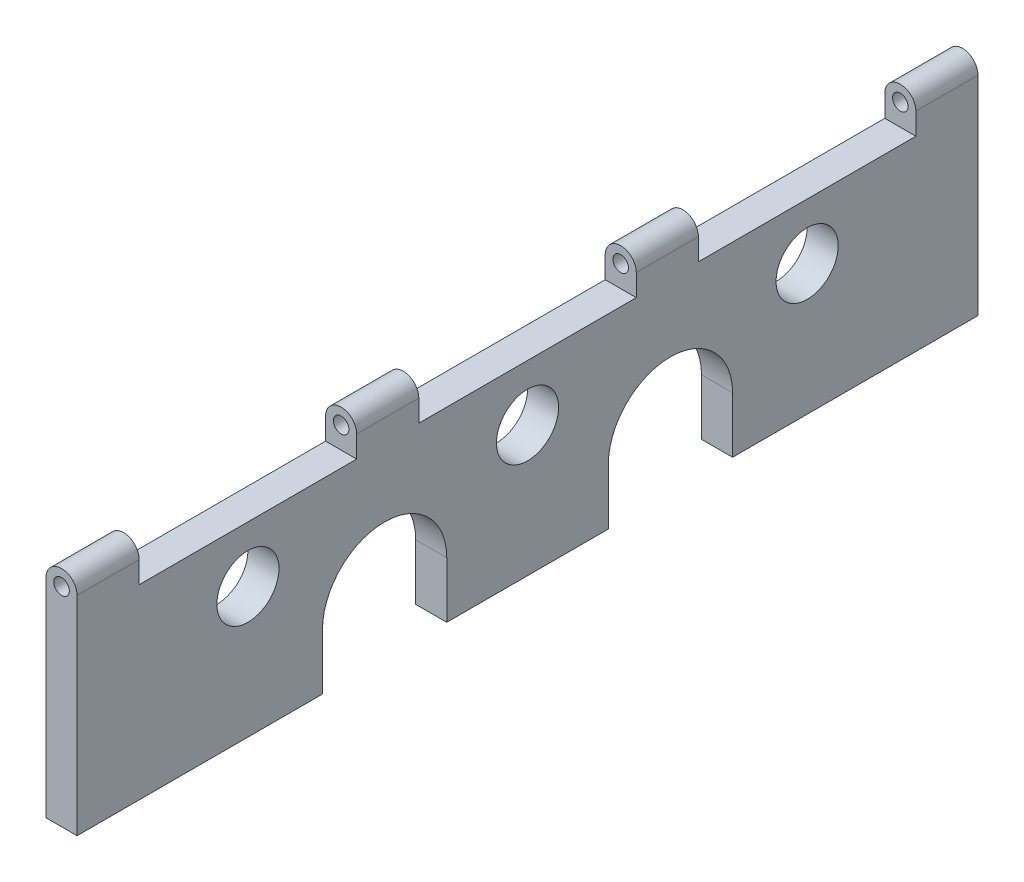
ISO-10303-21;
HEADER;
FILE_DESCRIPTION(('STEP AP214'),'2;1');
FILE_NAME('part.step','',(''),(''),'','','');
FILE_SCHEMA(('AUTOMOTIVE_DESIGN { 1 0 10303 214 1 1 1 1 }'));
ENDSEC;
DATA;
#1=APPLICATION_CONTEXT('core data for automotive mechanical design processes');
#2=APPLICATION_PROTOCOL_DEFINITION('international standard','automotive_design',2000,#1);
#3=PRODUCT_CONTEXT('',#1,'mechanical');
#4=PRODUCT('Part','Part','',(#3));
#5=PRODUCT_RELATED_PRODUCT_CATEGORY('part','',(#4));
#6=PRODUCT_DEFINITION_FORMATION('','',#4);
#7=PRODUCT_DEFINITION_CONTEXT('part definition',#1,'design');
#8=PRODUCT_DEFINITION('design','',#6,#7);
#9=PRODUCT_DEFINITION_SHAPE('','',#8);
#10=(LENGTH_UNIT() NAMED_UNIT(*) SI_UNIT(.MILLI.,.METRE.));
#11=(NAMED_UNIT(*) PLANE_ANGLE_UNIT() SI_UNIT($,.RADIAN.));
#12=(NAMED_UNIT(*) SI_UNIT($,.STERADIAN.) SOLID_ANGLE_UNIT());
#13=UNCERTAINTY_MEASURE_WITH_UNIT(LENGTH_MEASURE(1.E-05),#10,'distance_accuracy_value','');
#14=(GEOMETRIC_REPRESENTATION_CONTEXT(3) GLOBAL_UNCERTAINTY_ASSIGNED_CONTEXT((#13)) GLOBAL_UNIT_ASSIGNED_CONTEXT((#10,
#11,#12)) REPRESENTATION_CONTEXT('',''));
#15=CARTESIAN_POINT('',(0.,0.,0.));
#16=DIRECTION('',(0.,0.,1.));
#17=DIRECTION('',(1.,0.,0.));
#18=AXIS2_PLACEMENT_3D('',#15,#16,#17);
#19=CARTESIAN_POINT('',(5.,0.,0.));
#20=DIRECTION('',(0.,0.,-1.));
#21=DIRECTION('',(-1.,0.,0.));
#22=AXIS2_PLACEMENT_3D('',#19,#20,#21);
#23=PLANE('',#22);
#24=CARTESIAN_POINT('',(2.5,33.5,0.));
#25=DIRECTION('',(0.,0.,1.));
#26=DIRECTION('',(1.,0.,0.));
#27=AXIS2_PLACEMENT_3D('',#24,#25,#26);
#28=CIRCLE('',#27,1.25);
#29=CARTESIAN_POINT('',(3.75,33.5,0.));
#30=VERTEX_POINT('',#29);
#31=EDGE_CURVE('E504',#30,#30,#28,.T.);
#32=ORIENTED_EDGE('',*,*,#31,.F.);
#33=EDGE_LOOP('',(#32));
#34=FACE_BOUND('',#33,.T.);
#35=DIRECTION('',(0.,-1.,0.));
#36=VECTOR('',#35,1.);
#37=CARTESIAN_POINT('',(5.,0.,0.));
#38=LINE('',#37,#36);
#39=CARTESIAN_POINT('',(5.,33.5,0.));
#40=VERTEX_POINT('',#39);
#41=CARTESIAN_POINT('',(5.,0.,0.));
#42=VERTEX_POINT('',#41);
#43=EDGE_CURVE('E258',#40,#42,#38,.T.);
#44=ORIENTED_EDGE('',*,*,#43,.F.);
#45=CARTESIAN_POINT('',(2.5,33.5,0.));
#46=DIRECTION('',(0.,0.,1.));
#47=DIRECTION('',(1.,0.,0.));
#48=AXIS2_PLACEMENT_3D('',#45,#46,#47);
#49=CIRCLE('',#48,2.5);
#50=CARTESIAN_POINT('',(0.,33.5,0.));
#51=VERTEX_POINT('',#50);
#52=EDGE_CURVE('E242',#40,#51,#49,.T.);
#53=ORIENTED_EDGE('',*,*,#52,.T.);
#54=DIRECTION('',(0.,-1.,0.));
#55=VECTOR('',#54,1.);
#56=CARTESIAN_POINT('',(0.,0.,0.));
#57=LINE('',#56,#55);
#58=CARTESIAN_POINT('',(0.,0.,0.));
#59=VERTEX_POINT('',#58);
#60=EDGE_CURVE('E303',#51,#59,#57,.T.);
#61=ORIENTED_EDGE('',*,*,#60,.T.);
#62=DIRECTION('',(-1.,0.,0.));
#63=VECTOR('',#62,1.);
#64=CARTESIAN_POINT('',(5.,0.,0.));
#65=LINE('',#64,#63);
#66=EDGE_CURVE('E89',#42,#59,#65,.T.);
#67=ORIENTED_EDGE('',*,*,#66,.F.);
#68=EDGE_LOOP('',(#44,#53,#61,#67));
#69=FACE_BOUND('',#68,.T.);
#70=ADVANCED_FACE('F81',(#34,#69),#23,.F.);
#71=CARTESIAN_POINT('',(5.,0.,-145.));
#72=DIRECTION('',(0.,0.,1.));
#73=DIRECTION('',(1.,0.,0.));
#74=AXIS2_PLACEMENT_3D('',#71,#72,#73);
#75=PLANE('',#74);
#76=CARTESIAN_POINT('',(2.5,33.5,-145.));
#77=DIRECTION('',(0.,0.,1.));
#78=DIRECTION('',(1.,0.,0.));
#79=AXIS2_PLACEMENT_3D('',#76,#77,#78);
#80=CIRCLE('',#79,1.25);
#81=CARTESIAN_POINT('',(3.75,33.5,-145.));
#82=VERTEX_POINT('',#81);
#83=EDGE_CURVE('E407',#82,#82,#80,.T.);
#84=ORIENTED_EDGE('',*,*,#83,.T.);
#85=EDGE_LOOP('',(#84));
#86=FACE_BOUND('',#85,.T.);
#87=CARTESIAN_POINT('',(2.5,33.5,-145.));
#88=DIRECTION('',(0.,0.,1.));
#89=DIRECTION('',(1.,0.,0.));
#90=AXIS2_PLACEMENT_3D('',#87,#88,#89);
#91=CIRCLE('',#90,2.5);
#92=CARTESIAN_POINT('',(5.,33.5,-145.));
#93=VERTEX_POINT('',#92);
#94=CARTESIAN_POINT('',(0.,33.5,-145.));
#95=VERTEX_POINT('',#94);
#96=EDGE_CURVE('E252',#93,#95,#91,.T.);
#97=ORIENTED_EDGE('',*,*,#96,.F.);
#98=DIRECTION('',(0.,1.,0.));
#99=VECTOR('',#98,1.);
#100=CARTESIAN_POINT('',(5.,0.,-145.));
#101=LINE('',#100,#99);
#102=CARTESIAN_POINT('',(5.,0.,-145.));
#103=VERTEX_POINT('',#102);
#104=EDGE_CURVE('E295',#103,#93,#101,.T.);
#105=ORIENTED_EDGE('',*,*,#104,.F.);
#106=DIRECTION('',(-1.,0.,0.));
#107=VECTOR('',#106,1.);
#108=CARTESIAN_POINT('',(5.,0.,-145.));
#109=LINE('',#108,#107);
#110=CARTESIAN_POINT('',(0.,0.,-145.));
#111=VERTEX_POINT('',#110);
#112=EDGE_CURVE('E301',#103,#111,#109,.T.);
#113=ORIENTED_EDGE('',*,*,#112,.T.);
#114=DIRECTION('',(0.,1.,0.));
#115=VECTOR('',#114,1.);
#116=CARTESIAN_POINT('',(0.,0.,-145.));
#117=LINE('',#116,#115);
#118=EDGE_CURVE('E324',#111,#95,#117,.T.);
#119=ORIENTED_EDGE('',*,*,#118,.T.);
#120=EDGE_LOOP('',(#97,#105,#113,#119));
#121=FACE_BOUND('',#120,.T.);
#122=ADVANCED_FACE('F400',(#86,#121),#75,.F.);
#123=CARTESIAN_POINT('',(0.,0.,-9.99999999999998));
#124=DIRECTION('',(0.,0.,1.));
#125=DIRECTION('',(0.,-1.,0.));
#126=AXIS2_PLACEMENT_3D('',#123,#124,#125);
#127=PLANE('',#126);
#128=CARTESIAN_POINT('',(2.5,33.5,-9.99999999999998));
#129=DIRECTION('',(0.,0.,1.));
#130=DIRECTION('',(0.,-1.,0.));
#131=AXIS2_PLACEMENT_3D('',#128,#129,#130);
#132=CIRCLE('',#131,1.25);
#133=CARTESIAN_POINT('',(2.5,32.25,-9.99999999999998));
#134=VERTEX_POINT('',#133);
#135=EDGE_CURVE('E253',#134,#134,#132,.T.);
#136=ORIENTED_EDGE('',*,*,#135,.T.);
#137=EDGE_LOOP('',(#136));
#138=FACE_BOUND('',#137,.T.);
#139=CARTESIAN_POINT('',(2.5,33.5,-9.99999999999998));
#140=DIRECTION('',(0.,0.,1.));
#141=DIRECTION('',(0.,-1.,0.));
#142=AXIS2_PLACEMENT_3D('',#139,#140,#141);
#143=CIRCLE('',#142,2.5);
#144=CARTESIAN_POINT('',(5.,33.5,-9.99999999999998));
#145=VERTEX_POINT('',#144);
#146=CARTESIAN_POINT('',(0.,33.5,-9.99999999999998));
#147=VERTEX_POINT('',#146);
#148=EDGE_CURVE('E416',#145,#147,#143,.T.);
#149=ORIENTED_EDGE('',*,*,#148,.F.);
#150=DIRECTION('',(0.,-1.,0.));
#151=VECTOR('',#150,1.);
#152=CARTESIAN_POINT('',(5.,0.,-9.99999999999998));
#153=LINE('',#152,#151);
#154=CARTESIAN_POINT('',(5.,30.,-9.99999999999999));
#155=VERTEX_POINT('',#154);
#156=EDGE_CURVE('E261',#145,#155,#153,.T.);
#157=ORIENTED_EDGE('',*,*,#156,.T.);
#158=DIRECTION('',(1.,0.,0.));
#159=VECTOR('',#158,1.);
#160=CARTESIAN_POINT('',(0.,30.,-9.99999999999999));
#161=LINE('',#160,#159);
#162=CARTESIAN_POINT('',(0.,30.,-9.99999999999999));
#163=VERTEX_POINT('',#162);
#164=EDGE_CURVE('E453',#163,#155,#161,.T.);
#165=ORIENTED_EDGE('',*,*,#164,.F.);
#166=DIRECTION('',(0.,-1.,0.));
#167=VECTOR('',#166,1.);
#168=CARTESIAN_POINT('',(0.,0.,-9.99999999999998));
#169=LINE('',#168,#167);
#170=EDGE_CURVE('E451',#147,#163,#169,.T.);
#171=ORIENTED_EDGE('',*,*,#170,.F.);
#172=EDGE_LOOP('',(#149,#157,#165,#171));
#173=FACE_BOUND('',#172,.T.);
#174=ADVANCED_FACE('F499',(#138,#173),#127,.F.);
#175=CARTESIAN_POINT('',(0.,0.,-55.));
#176=DIRECTION('',(0.,0.,1.));
#177=DIRECTION('',(0.,-1.,0.));
#178=AXIS2_PLACEMENT_3D('',#175,#176,#177);
#179=PLANE('',#178);
#180=CARTESIAN_POINT('',(2.5,33.5,-55.));
#181=DIRECTION('',(0.,0.,1.));
#182=DIRECTION('',(0.,-1.,0.));
#183=AXIS2_PLACEMENT_3D('',#180,#181,#182);
#184=CIRCLE('',#183,1.25);
#185=CARTESIAN_POINT('',(2.5,32.25,-55.));
#186=VERTEX_POINT('',#185);
#187=EDGE_CURVE('E520',#186,#186,#184,.T.);
#188=ORIENTED_EDGE('',*,*,#187,.T.);
#189=EDGE_LOOP('',(#188));
#190=FACE_BOUND('',#189,.T.);
#191=CARTESIAN_POINT('',(2.5,33.5,-55.));
#192=DIRECTION('',(0.,0.,1.));
#193=DIRECTION('',(0.,-1.,0.));
#194=AXIS2_PLACEMENT_3D('',#191,#192,#193);
#195=CIRCLE('',#194,2.5);
#196=CARTESIAN_POINT('',(5.,33.5,-55.));
#197=VERTEX_POINT('',#196);
#198=CARTESIAN_POINT('',(0.,33.5,-55.));
#199=VERTEX_POINT('',#198);
#200=EDGE_CURVE('E419',#197,#199,#195,.T.);
#201=ORIENTED_EDGE('',*,*,#200,.F.);
#202=DIRECTION('',(0.,-1.,0.));
#203=VECTOR('',#202,1.);
#204=CARTESIAN_POINT('',(5.,0.,-55.));
#205=LINE('',#204,#203);
#206=CARTESIAN_POINT('',(5.,30.,-55.));
#207=VERTEX_POINT('',#206);
#208=EDGE_CURVE('E441',#197,#207,#205,.T.);
#209=ORIENTED_EDGE('',*,*,#208,.T.);
#210=DIRECTION('',(1.,0.,0.));
#211=VECTOR('',#210,1.);
#212=CARTESIAN_POINT('',(0.,30.,-55.));
#213=LINE('',#212,#211);
#214=CARTESIAN_POINT('',(0.,30.,-55.));
#215=VERTEX_POINT('',#214);
#216=EDGE_CURVE('E446',#215,#207,#213,.T.);
#217=ORIENTED_EDGE('',*,*,#216,.F.);
#218=DIRECTION('',(0.,-1.,0.));
#219=VECTOR('',#218,1.);
#220=CARTESIAN_POINT('',(0.,0.,-55.));
#221=LINE('',#220,#219);
#222=EDGE_CURVE('E440',#199,#215,#221,.T.);
#223=ORIENTED_EDGE('',*,*,#222,.F.);
#224=EDGE_LOOP('',(#201,#209,#217,#223));
#225=FACE_BOUND('',#224,.T.);
#226=ADVANCED_FACE('F547',(#190,#225),#179,.F.);
#227=CARTESIAN_POINT('',(0.,0.,-45.));
#228=DIRECTION('',(0.,0.,1.));
#229=DIRECTION('',(0.,-1.,0.));
#230=AXIS2_PLACEMENT_3D('',#227,#228,#229);
#231=PLANE('',#230);
#232=CARTESIAN_POINT('',(2.5,33.5,-45.));
#233=DIRECTION('',(0.,0.,1.));
#234=DIRECTION('',(0.,-1.,0.));
#235=AXIS2_PLACEMENT_3D('',#232,#233,#234);
#236=CIRCLE('',#235,1.25);
#237=CARTESIAN_POINT('',(2.5,32.25,-45.));
#238=VERTEX_POINT('',#237);
#239=EDGE_CURVE('E517',#238,#238,#236,.T.);
#240=ORIENTED_EDGE('',*,*,#239,.F.);
#241=EDGE_LOOP('',(#240));
#242=FACE_BOUND('',#241,.T.);
#243=DIRECTION('',(0.,-1.,0.));
#244=VECTOR('',#243,1.);
#245=CARTESIAN_POINT('',(5.,0.,-45.));
#246=LINE('',#245,#244);
#247=CARTESIAN_POINT('',(5.,33.5,-45.));
#248=VERTEX_POINT('',#247);
#249=CARTESIAN_POINT('',(5.,30.,-45.));
#250=VERTEX_POINT('',#249);
#251=EDGE_CURVE('E435',#248,#250,#246,.T.);
#252=ORIENTED_EDGE('',*,*,#251,.F.);
#253=CARTESIAN_POINT('',(2.5,33.5,-45.));
#254=DIRECTION('',(0.,0.,1.));
#255=DIRECTION('',(0.,-1.,0.));
#256=AXIS2_PLACEMENT_3D('',#253,#254,#255);
#257=CIRCLE('',#256,2.5);
#258=CARTESIAN_POINT('',(0.,33.5,-45.));
#259=VERTEX_POINT('',#258);
#260=EDGE_CURVE('E532',#248,#259,#257,.T.);
#261=ORIENTED_EDGE('',*,*,#260,.T.);
#262=DIRECTION('',(0.,-1.,0.));
#263=VECTOR('',#262,1.);
#264=CARTESIAN_POINT('',(0.,0.,-45.));
#265=LINE('',#264,#263);
#266=CARTESIAN_POINT('',(0.,30.,-45.));
#267=VERTEX_POINT('',#266);
#268=EDGE_CURVE('E438',#259,#267,#265,.T.);
#269=ORIENTED_EDGE('',*,*,#268,.T.);
#270=DIRECTION('',(1.,0.,0.));
#271=VECTOR('',#270,1.);
#272=CARTESIAN_POINT('',(0.,30.,-45.));
#273=LINE('',#272,#271);
#274=EDGE_CURVE('E443',#267,#250,#273,.T.);
#275=ORIENTED_EDGE('',*,*,#274,.T.);
#276=EDGE_LOOP('',(#252,#261,#269,#275));
#277=FACE_BOUND('',#276,.T.);
#278=ADVANCED_FACE('F652',(#242,#277),#231,.T.);
#279=CARTESIAN_POINT('',(0.,0.,-100.));
#280=DIRECTION('',(0.,0.,1.));
#281=DIRECTION('',(1.,0.,0.));
#282=AXIS2_PLACEMENT_3D('',#279,#280,#281);
#283=PLANE('',#282);
#284=CARTESIAN_POINT('',(2.5,33.5,-100.));
#285=DIRECTION('',(0.,0.,1.));
#286=DIRECTION('',(1.,0.,0.));
#287=AXIS2_PLACEMENT_3D('',#284,#285,#286);
#288=CIRCLE('',#287,1.25);
#289=CARTESIAN_POINT('',(3.75,33.5,-100.));
#290=VERTEX_POINT('',#289);
#291=EDGE_CURVE('E514',#290,#290,#288,.T.);
#292=ORIENTED_EDGE('',*,*,#291,.T.);
#293=EDGE_LOOP('',(#292));
#294=FACE_BOUND('',#293,.T.);
#295=CARTESIAN_POINT('',(2.5,33.5,-100.));
#296=DIRECTION('',(0.,0.,1.));
#297=DIRECTION('',(1.,0.,0.));
#298=AXIS2_PLACEMENT_3D('',#295,#296,#297);
#299=CIRCLE('',#298,2.5);
#300=CARTESIAN_POINT('',(5.,33.5,-100.));
#301=VERTEX_POINT('',#300);
#302=CARTESIAN_POINT('',(0.,33.5,-100.));
#303=VERTEX_POINT('',#302);
#304=EDGE_CURVE('E530',#301,#303,#299,.T.);
#305=ORIENTED_EDGE('',*,*,#304,.F.);
#306=DIRECTION('',(0.,-1.,0.));
#307=VECTOR('',#306,1.);
#308=CARTESIAN_POINT('',(5.,0.,-100.));
#309=LINE('',#308,#307);
#310=CARTESIAN_POINT('',(5.,30.,-100.));
#311=VERTEX_POINT('',#310);
#312=EDGE_CURVE('E427',#301,#311,#309,.T.);
#313=ORIENTED_EDGE('',*,*,#312,.T.);
#314=DIRECTION('',(1.,0.,0.));
#315=VECTOR('',#314,1.);
#316=CARTESIAN_POINT('',(0.,30.,-100.));
#317=LINE('',#316,#315);
#318=CARTESIAN_POINT('',(0.,30.,-100.));
#319=VERTEX_POINT('',#318);
#320=EDGE_CURVE('E432',#319,#311,#317,.T.);
#321=ORIENTED_EDGE('',*,*,#320,.F.);
#322=DIRECTION('',(0.,-1.,0.));
#323=VECTOR('',#322,1.);
#324=CARTESIAN_POINT('',(0.,0.,-100.));
#325=LINE('',#324,#323);
#326=EDGE_CURVE('E426',#303,#319,#325,.T.);
#327=ORIENTED_EDGE('',*,*,#326,.F.);
#328=EDGE_LOOP('',(#305,#313,#321,#327));
#329=FACE_BOUND('',#328,.T.);
#330=ADVANCED_FACE('F570',(#294,#329),#283,.F.);
#331=CARTESIAN_POINT('',(0.,0.,-90.));
#332=DIRECTION('',(0.,0.,1.));
#333=DIRECTION('',(1.,0.,0.));
#334=AXIS2_PLACEMENT_3D('',#331,#332,#333);
#335=PLANE('',#334);
#336=CARTESIAN_POINT('',(2.5,33.5,-90.));
#337=DIRECTION('',(0.,0.,1.));
#338=DIRECTION('',(1.,0.,0.));
#339=AXIS2_PLACEMENT_3D('',#336,#337,#338);
#340=CIRCLE('',#339,1.25);
#341=CARTESIAN_POINT('',(3.75,33.5,-90.));
#342=VERTEX_POINT('',#341);
#343=EDGE_CURVE('E508',#342,#342,#340,.T.);
#344=ORIENTED_EDGE('',*,*,#343,.F.);
#345=EDGE_LOOP('',(#344));
#346=FACE_BOUND('',#345,.T.);
#347=DIRECTION('',(0.,-1.,0.));
#348=VECTOR('',#347,1.);
#349=CARTESIAN_POINT('',(5.,0.,-90.));
#350=LINE('',#349,#348);
#351=CARTESIAN_POINT('',(5.,33.5,-90.));
#352=VERTEX_POINT('',#351);
#353=CARTESIAN_POINT('',(5.,30.,-90.));
#354=VERTEX_POINT('',#353);
#355=EDGE_CURVE('E423',#352,#354,#350,.T.);
#356=ORIENTED_EDGE('',*,*,#355,.F.);
#357=CARTESIAN_POINT('',(2.5,33.5,-90.));
#358=DIRECTION('',(0.,0.,1.));
#359=DIRECTION('',(1.,0.,0.));
#360=AXIS2_PLACEMENT_3D('',#357,#358,#359);
#361=CIRCLE('',#360,2.5);
#362=CARTESIAN_POINT('',(0.,33.5,-90.));
#363=VERTEX_POINT('',#362);
#364=EDGE_CURVE('E528',#352,#363,#361,.T.);
#365=ORIENTED_EDGE('',*,*,#364,.T.);
#366=DIRECTION('',(0.,-1.,0.));
#367=VECTOR('',#366,1.);
#368=CARTESIAN_POINT('',(0.,0.,-90.));
#369=LINE('',#368,#367);
#370=CARTESIAN_POINT('',(0.,30.,-90.));
#371=VERTEX_POINT('',#370);
#372=EDGE_CURVE('E424',#363,#371,#369,.T.);
#373=ORIENTED_EDGE('',*,*,#372,.T.);
#374=DIRECTION('',(1.,0.,0.));
#375=VECTOR('',#374,1.);
#376=CARTESIAN_POINT('',(0.,30.,-90.));
#377=LINE('',#376,#375);
#378=EDGE_CURVE('E429',#371,#354,#377,.T.);
#379=ORIENTED_EDGE('',*,*,#378,.T.);
#380=EDGE_LOOP('',(#356,#365,#373,#379));
#381=FACE_BOUND('',#380,.T.);
#382=ADVANCED_FACE('F565',(#346,#381),#335,.T.);
#383=CARTESIAN_POINT('',(0.,6.24500451351651E-13,-135.));
#384=DIRECTION('',(0.,0.,1.));
#385=DIRECTION('',(0.,-1.,0.));
#386=AXIS2_PLACEMENT_3D('',#383,#384,#385);
#387=PLANE('',#386);
#388=CARTESIAN_POINT('',(2.5,33.5,-135.));
#389=DIRECTION('',(0.,0.,1.));
#390=DIRECTION('',(0.,-1.,0.));
#391=AXIS2_PLACEMENT_3D('',#388,#389,#390);
#392=CIRCLE('',#391,1.25);
#393=CARTESIAN_POINT('',(2.5,32.25,-135.));
#394=VERTEX_POINT('',#393);
#395=EDGE_CURVE('E84',#394,#394,#392,.T.);
#396=ORIENTED_EDGE('',*,*,#395,.F.);
#397=EDGE_LOOP('',(#396));
#398=FACE_BOUND('',#397,.T.);
#399=DIRECTION('',(0.,-1.,0.));
#400=VECTOR('',#399,1.);
#401=CARTESIAN_POINT('',(5.,6.24500451351651E-13,-135.));
#402=LINE('',#401,#400);
#403=CARTESIAN_POINT('',(5.,33.5,-135.));
#404=VERTEX_POINT('',#403);
#405=CARTESIAN_POINT('',(5.,30.,-135.));
#406=VERTEX_POINT('',#405);
#407=EDGE_CURVE('E404',#404,#406,#402,.T.);
#408=ORIENTED_EDGE('',*,*,#407,.F.);
#409=CARTESIAN_POINT('',(2.5,33.5,-135.));
#410=DIRECTION('',(0.,0.,1.));
#411=DIRECTION('',(0.,-1.,0.));
#412=AXIS2_PLACEMENT_3D('',#409,#410,#411);
#413=CIRCLE('',#412,2.5);
#414=CARTESIAN_POINT('',(0.,33.5,-135.));
#415=VERTEX_POINT('',#414);
#416=EDGE_CURVE('E12',#404,#415,#413,.T.);
#417=ORIENTED_EDGE('',*,*,#416,.T.);
#418=DIRECTION('',(0.,-1.,0.));
#419=VECTOR('',#418,1.);
#420=CARTESIAN_POINT('',(0.,6.24500451351651E-13,-135.));
#421=LINE('',#420,#419);
#422=CARTESIAN_POINT('',(0.,30.,-135.));
#423=VERTEX_POINT('',#422);
#424=EDGE_CURVE('E415',#415,#423,#421,.T.);
#425=ORIENTED_EDGE('',*,*,#424,.T.);
#426=DIRECTION('',(1.,0.,0.));
#427=VECTOR('',#426,1.);
#428=CARTESIAN_POINT('',(0.,30.,-135.));
#429=LINE('',#428,#427);
#430=EDGE_CURVE('E414',#423,#406,#429,.T.);
#431=ORIENTED_EDGE('',*,*,#430,.T.);
#432=EDGE_LOOP('',(#408,#417,#425,#431));
#433=FACE_BOUND('',#432,.T.);
#434=ADVANCED_FACE('F411',(#398,#433),#387,.T.);
#435=CARTESIAN_POINT('',(5.,9.,-95.5));
#436=DIRECTION('',(1.,0.,0.));
#437=DIRECTION('',(0.,0.,-1.));
#438=AXIS2_PLACEMENT_3D('',#435,#436,#437);
#439=PLANE('',#438);
#440=CARTESIAN_POINT('',(5.,21.,-72.5));
#441=DIRECTION('',(1.,0.,0.));
#442=DIRECTION('',(0.,0.,-1.));
#443=AXIS2_PLACEMENT_3D('',#440,#441,#442);
#444=CIRCLE('',#443,4.99999999999999);
#445=CARTESIAN_POINT('',(5.,21.,-77.5));
#446=VERTEX_POINT('',#445);
#447=EDGE_CURVE('E464',#446,#446,#444,.T.);
#448=ORIENTED_EDGE('',*,*,#447,.F.);
#449=EDGE_LOOP('',(#448));
#450=FACE_BOUND('',#449,.T.);
#451=CARTESIAN_POINT('',(5.,21.,-27.5));
#452=DIRECTION('',(1.,0.,0.));
#453=DIRECTION('',(0.,0.,-1.));
#454=AXIS2_PLACEMENT_3D('',#451,#452,#453);
#455=CIRCLE('',#454,5.);
#456=CARTESIAN_POINT('',(5.,21.,-32.5));
#457=VERTEX_POINT('',#456);
#458=EDGE_CURVE('E306',#457,#457,#455,.T.);
#459=ORIENTED_EDGE('',*,*,#458,.F.);
#460=EDGE_LOOP('',(#459));
#461=FACE_BOUND('',#460,.T.);
#462=CARTESIAN_POINT('',(5.,21.,-117.5));
#463=DIRECTION('',(1.,0.,0.));
#464=DIRECTION('',(0.,0.,-1.));
#465=AXIS2_PLACEMENT_3D('',#462,#463,#464);
#466=CIRCLE('',#465,4.99999999999999);
#467=CARTESIAN_POINT('',(5.,21.,-122.5));
#468=VERTEX_POINT('',#467);
#469=EDGE_CURVE('E458',#468,#468,#466,.T.);
#470=ORIENTED_EDGE('',*,*,#469,.F.);
#471=EDGE_LOOP('',(#470));
#472=FACE_BOUND('',#471,.T.);
#473=ORIENTED_EDGE('',*,*,#104,.T.);
#474=DIRECTION('',(0.,0.,1.));
#475=VECTOR('',#474,1.);
#476=CARTESIAN_POINT('',(5.,33.5,-145.));
#477=LINE('',#476,#475);
#478=EDGE_CURVE('E264',#93,#404,#477,.T.);
#479=ORIENTED_EDGE('',*,*,#478,.T.);
#480=ORIENTED_EDGE('',*,*,#407,.T.);
#481=DIRECTION('',(0.,0.,1.));
#482=VECTOR('',#481,1.);
#483=CARTESIAN_POINT('',(5.,30.,0.));
#484=LINE('',#483,#482);
#485=EDGE_CURVE('E298',#406,#311,#484,.T.);
#486=ORIENTED_EDGE('',*,*,#485,.T.);
#487=ORIENTED_EDGE('',*,*,#312,.F.);
#488=EDGE_CURVE('E408',#301,#352,#477,.T.);
#489=ORIENTED_EDGE('',*,*,#488,.T.);
#490=ORIENTED_EDGE('',*,*,#355,.T.);
#491=EDGE_CURVE('E302',#354,#207,#484,.T.);
#492=ORIENTED_EDGE('',*,*,#491,.T.);
#493=ORIENTED_EDGE('',*,*,#208,.F.);
#494=EDGE_CURVE('E262',#197,#248,#477,.T.);
#495=ORIENTED_EDGE('',*,*,#494,.T.);
#496=ORIENTED_EDGE('',*,*,#251,.T.);
#497=EDGE_CURVE('E297',#250,#155,#484,.T.);
#498=ORIENTED_EDGE('',*,*,#497,.T.);
#499=ORIENTED_EDGE('',*,*,#156,.F.);
#500=EDGE_CURVE('E245',#145,#40,#477,.T.);
#501=ORIENTED_EDGE('',*,*,#500,.T.);
#502=ORIENTED_EDGE('',*,*,#43,.T.);
#503=DIRECTION('',(0.,0.,-1.));
#504=VECTOR('',#503,1.);
#505=CARTESIAN_POINT('',(5.,0.,0.));
#506=LINE('',#505,#504);
#507=CARTESIAN_POINT('',(5.,0.,-39.5));
#508=VERTEX_POINT('',#507);
#509=EDGE_CURVE('E267',#42,#508,#506,.T.);
#510=ORIENTED_EDGE('',*,*,#509,.T.);
#511=DIRECTION('',(0.,1.,0.));
#512=VECTOR('',#511,1.);
#513=CARTESIAN_POINT('',(5.,9.,-39.5));
#514=LINE('',#513,#512);
#515=CARTESIAN_POINT('',(5.,9.,-39.5));
#516=VERTEX_POINT('',#515);
#517=EDGE_CURVE('E270',#508,#516,#514,.T.);
#518=ORIENTED_EDGE('',*,*,#517,.T.);
#519=CARTESIAN_POINT('',(5.,9.,-49.5));
#520=DIRECTION('',(-1.,0.,0.));
#521=DIRECTION('',(0.,0.,-1.));
#522=AXIS2_PLACEMENT_3D('',#519,#520,#521);
#523=CIRCLE('',#522,10.);
#524=CARTESIAN_POINT('',(5.,9.,-59.5));
#525=VERTEX_POINT('',#524);
#526=EDGE_CURVE('E281',#516,#525,#523,.T.);
#527=ORIENTED_EDGE('',*,*,#526,.T.);
#528=DIRECTION('',(0.,-1.,0.));
#529=VECTOR('',#528,1.);
#530=CARTESIAN_POINT('',(5.,9.,-59.5));
#531=LINE('',#530,#529);
#532=CARTESIAN_POINT('',(5.,0.,-59.5));
#533=VERTEX_POINT('',#532);
#534=EDGE_CURVE('E283',#525,#533,#531,.T.);
#535=ORIENTED_EDGE('',*,*,#534,.T.);
#536=DIRECTION('',(0.,0.,-1.));
#537=VECTOR('',#536,1.);
#538=CARTESIAN_POINT('',(5.,0.,-59.5));
#539=LINE('',#538,#537);
#540=CARTESIAN_POINT('',(5.,0.,-85.5));
#541=VERTEX_POINT('',#540);
#542=EDGE_CURVE('E285',#533,#541,#539,.T.);
#543=ORIENTED_EDGE('',*,*,#542,.T.);
#544=DIRECTION('',(0.,1.,0.));
#545=VECTOR('',#544,1.);
#546=CARTESIAN_POINT('',(5.,9.,-85.5));
#547=LINE('',#546,#545);
#548=CARTESIAN_POINT('',(5.,9.,-85.5));
#549=VERTEX_POINT('',#548);
#550=EDGE_CURVE('E287',#541,#549,#547,.T.);
#551=ORIENTED_EDGE('',*,*,#550,.T.);
#552=CARTESIAN_POINT('',(5.,9.,-95.5));
#553=DIRECTION('',(-1.,0.,0.));
#554=DIRECTION('',(0.,0.,-1.));
#555=AXIS2_PLACEMENT_3D('',#552,#553,#554);
#556=CIRCLE('',#555,10.);
#557=CARTESIAN_POINT('',(5.,9.,-105.5));
#558=VERTEX_POINT('',#557);
#559=EDGE_CURVE('E289',#549,#558,#556,.T.);
#560=ORIENTED_EDGE('',*,*,#559,.T.);
#561=DIRECTION('',(0.,-1.,0.));
#562=VECTOR('',#561,1.);
#563=CARTESIAN_POINT('',(5.,9.,-105.5));
#564=LINE('',#563,#562);
#565=CARTESIAN_POINT('',(5.,0.,-105.5));
#566=VERTEX_POINT('',#565);
#567=EDGE_CURVE('E291',#558,#566,#564,.T.);
#568=ORIENTED_EDGE('',*,*,#567,.T.);
#569=DIRECTION('',(0.,0.,-1.));
#570=VECTOR('',#569,1.);
#571=CARTESIAN_POINT('',(5.,0.,-105.5));
#572=LINE('',#571,#570);
#573=EDGE_CURVE('E293',#566,#103,#572,.T.);
#574=ORIENTED_EDGE('',*,*,#573,.T.);
#575=EDGE_LOOP('',(#473,#479,#480,#486,#487,#489,#490,#492,#493,#495,#496,#498,#499,#501,#502,
#510,#518,#527,#535,#543,#551,#560,#568,#574));
#576=FACE_BOUND('',#575,.T.);
#577=ADVANCED_FACE('F257',(#450,#461,#472,#576),#439,.T.);
#578=CARTESIAN_POINT('',(0.,9.,-95.5));
#579=DIRECTION('',(1.,0.,0.));
#580=DIRECTION('',(0.,0.,-1.));
#581=AXIS2_PLACEMENT_3D('',#578,#579,#580);
#582=PLANE('',#581);
#583=CARTESIAN_POINT('',(0.,21.,-27.5));
#584=DIRECTION('',(1.,0.,0.));
#585=DIRECTION('',(0.,0.,-1.));
#586=AXIS2_PLACEMENT_3D('',#583,#584,#585);
#587=CIRCLE('',#586,5.);
#588=CARTESIAN_POINT('',(0.,21.,-32.5));
#589=VERTEX_POINT('',#588);
#590=EDGE_CURVE('E277',#589,#589,#587,.T.);
#591=ORIENTED_EDGE('',*,*,#590,.T.);
#592=EDGE_LOOP('',(#591));
#593=FACE_BOUND('',#592,.T.);
#594=CARTESIAN_POINT('',(0.,21.,-72.5));
#595=DIRECTION('',(1.,0.,0.));
#596=DIRECTION('',(0.,0.,-1.));
#597=AXIS2_PLACEMENT_3D('',#594,#595,#596);
#598=CIRCLE('',#597,4.99999999999999);
#599=CARTESIAN_POINT('',(0.,21.,-77.5));
#600=VERTEX_POINT('',#599);
#601=EDGE_CURVE('E461',#600,#600,#598,.T.);
#602=ORIENTED_EDGE('',*,*,#601,.T.);
#603=EDGE_LOOP('',(#602));
#604=FACE_BOUND('',#603,.T.);
#605=CARTESIAN_POINT('',(0.,21.,-117.5));
#606=DIRECTION('',(1.,0.,0.));
#607=DIRECTION('',(0.,0.,-1.));
#608=AXIS2_PLACEMENT_3D('',#605,#606,#607);
#609=CIRCLE('',#608,4.99999999999999);
#610=CARTESIAN_POINT('',(0.,21.,-122.5));
#611=VERTEX_POINT('',#610);
#612=EDGE_CURVE('E457',#611,#611,#609,.T.);
#613=ORIENTED_EDGE('',*,*,#612,.T.);
#614=EDGE_LOOP('',(#613));
#615=FACE_BOUND('',#614,.T.);
#616=DIRECTION('',(0.,0.,1.));
#617=VECTOR('',#616,1.);
#618=CARTESIAN_POINT('',(0.,33.5,-145.));
#619=LINE('',#618,#617);
#620=EDGE_CURVE('E526',#95,#415,#619,.T.);
#621=ORIENTED_EDGE('',*,*,#620,.F.);
#622=ORIENTED_EDGE('',*,*,#118,.F.);
#623=DIRECTION('',(0.,0.,-1.));
#624=VECTOR('',#623,1.);
#625=CARTESIAN_POINT('',(0.,0.,-105.5));
#626=LINE('',#625,#624);
#627=CARTESIAN_POINT('',(0.,0.,-105.5));
#628=VERTEX_POINT('',#627);
#629=EDGE_CURVE('E322',#628,#111,#626,.T.);
#630=ORIENTED_EDGE('',*,*,#629,.F.);
#631=DIRECTION('',(0.,-1.,0.));
#632=VECTOR('',#631,1.);
#633=CARTESIAN_POINT('',(0.,9.,-105.5));
#634=LINE('',#633,#632);
#635=CARTESIAN_POINT('',(0.,9.,-105.5));
#636=VERTEX_POINT('',#635);
#637=EDGE_CURVE('E320',#636,#628,#634,.T.);
#638=ORIENTED_EDGE('',*,*,#637,.F.);
#639=CARTESIAN_POINT('',(0.,9.,-95.5));
#640=DIRECTION('',(-1.,0.,0.));
#641=DIRECTION('',(0.,0.,-1.));
#642=AXIS2_PLACEMENT_3D('',#639,#640,#641);
#643=CIRCLE('',#642,10.);
#644=CARTESIAN_POINT('',(0.,9.,-85.5));
#645=VERTEX_POINT('',#644);
#646=EDGE_CURVE('E318',#645,#636,#643,.T.);
#647=ORIENTED_EDGE('',*,*,#646,.F.);
#648=DIRECTION('',(0.,1.,0.));
#649=VECTOR('',#648,1.);
#650=CARTESIAN_POINT('',(0.,9.,-85.5));
#651=LINE('',#650,#649);
#652=CARTESIAN_POINT('',(0.,0.,-85.5));
#653=VERTEX_POINT('',#652);
#654=EDGE_CURVE('E316',#653,#645,#651,.T.);
#655=ORIENTED_EDGE('',*,*,#654,.F.);
#656=DIRECTION('',(0.,0.,-1.));
#657=VECTOR('',#656,1.);
#658=CARTESIAN_POINT('',(0.,0.,-59.5));
#659=LINE('',#658,#657);
#660=CARTESIAN_POINT('',(0.,0.,-59.5));
#661=VERTEX_POINT('',#660);
#662=EDGE_CURVE('E314',#661,#653,#659,.T.);
#663=ORIENTED_EDGE('',*,*,#662,.F.);
#664=DIRECTION('',(0.,-1.,0.));
#665=VECTOR('',#664,1.);
#666=CARTESIAN_POINT('',(0.,9.,-59.5));
#667=LINE('',#666,#665);
#668=CARTESIAN_POINT('',(0.,9.,-59.5));
#669=VERTEX_POINT('',#668);
#670=EDGE_CURVE('E312',#669,#661,#667,.T.);
#671=ORIENTED_EDGE('',*,*,#670,.F.);
#672=CARTESIAN_POINT('',(0.,9.,-49.5));
#673=DIRECTION('',(-1.,0.,0.));
#674=DIRECTION('',(0.,0.,-1.));
#675=AXIS2_PLACEMENT_3D('',#672,#673,#674);
#676=CIRCLE('',#675,10.);
#677=CARTESIAN_POINT('',(0.,9.,-39.5));
#678=VERTEX_POINT('',#677);
#679=EDGE_CURVE('E310',#678,#669,#676,.T.);
#680=ORIENTED_EDGE('',*,*,#679,.F.);
#681=DIRECTION('',(0.,1.,0.));
#682=VECTOR('',#681,1.);
#683=CARTESIAN_POINT('',(0.,9.,-39.5));
#684=LINE('',#683,#682);
#685=CARTESIAN_POINT('',(0.,0.,-39.5));
#686=VERTEX_POINT('',#685);
#687=EDGE_CURVE('E308',#686,#678,#684,.T.);
#688=ORIENTED_EDGE('',*,*,#687,.F.);
#689=DIRECTION('',(0.,0.,-1.));
#690=VECTOR('',#689,1.);
#691=CARTESIAN_POINT('',(0.,0.,0.));
#692=LINE('',#691,#690);
#693=EDGE_CURVE('E305',#59,#686,#692,.T.);
#694=ORIENTED_EDGE('',*,*,#693,.F.);
#695=ORIENTED_EDGE('',*,*,#60,.F.);
#696=EDGE_CURVE('E248',#147,#51,#619,.T.);
#697=ORIENTED_EDGE('',*,*,#696,.F.);
#698=ORIENTED_EDGE('',*,*,#170,.T.);
#699=DIRECTION('',(0.,0.,1.));
#700=VECTOR('',#699,1.);
#701=CARTESIAN_POINT('',(0.,30.,0.));
#702=LINE('',#701,#700);
#703=EDGE_CURVE('E275',#267,#163,#702,.T.);
#704=ORIENTED_EDGE('',*,*,#703,.F.);
#705=ORIENTED_EDGE('',*,*,#268,.F.);
#706=EDGE_CURVE('E96',#199,#259,#619,.T.);
#707=ORIENTED_EDGE('',*,*,#706,.F.);
#708=ORIENTED_EDGE('',*,*,#222,.T.);
#709=EDGE_CURVE('E273',#371,#215,#702,.T.);
#710=ORIENTED_EDGE('',*,*,#709,.F.);
#711=ORIENTED_EDGE('',*,*,#372,.F.);
#712=EDGE_CURVE('E104',#303,#363,#619,.T.);
#713=ORIENTED_EDGE('',*,*,#712,.F.);
#714=ORIENTED_EDGE('',*,*,#326,.T.);
#715=EDGE_CURVE('E268',#423,#319,#702,.T.);
#716=ORIENTED_EDGE('',*,*,#715,.F.);
#717=ORIENTED_EDGE('',*,*,#424,.F.);
#718=EDGE_LOOP('',(#621,#622,#630,#638,#647,#655,#663,#671,#680,#688,#694,#695,#697,#698,#704,
#705,#707,#708,#710,#711,#713,#714,#716,#717));
#719=FACE_BOUND('',#718,.T.);
#720=ADVANCED_FACE('F474',(#593,#604,#615,#719),#582,.F.);
#721=CARTESIAN_POINT('',(5.,30.,0.));
#722=DIRECTION('',(0.,-1.,0.));
#723=DIRECTION('',(0.,0.,-1.));
#724=AXIS2_PLACEMENT_3D('',#721,#722,#723);
#725=PLANE('',#724);
#726=ORIENTED_EDGE('',*,*,#485,.F.);
#727=ORIENTED_EDGE('',*,*,#430,.F.);
#728=ORIENTED_EDGE('',*,*,#715,.T.);
#729=ORIENTED_EDGE('',*,*,#320,.T.);
#730=EDGE_LOOP('',(#726,#727,#728,#729));
#731=FACE_BOUND('',#730,.T.);
#732=ADVANCED_FACE('F491',(#731),#725,.F.);
#733=ORIENTED_EDGE('',*,*,#491,.F.);
#734=ORIENTED_EDGE('',*,*,#378,.F.);
#735=ORIENTED_EDGE('',*,*,#709,.T.);
#736=ORIENTED_EDGE('',*,*,#216,.T.);
#737=EDGE_LOOP('',(#733,#734,#735,#736));
#738=FACE_BOUND('',#737,.T.);
#739=ADVANCED_FACE('F492',(#738),#725,.F.);
#740=CARTESIAN_POINT('',(5.,0.,0.));
#741=DIRECTION('',(0.,1.,0.));
#742=DIRECTION('',(0.,0.,1.));
#743=AXIS2_PLACEMENT_3D('',#740,#741,#742);
#744=PLANE('',#743);
#745=ORIENTED_EDGE('',*,*,#693,.T.);
#746=DIRECTION('',(-1.,0.,0.));
#747=VECTOR('',#746,1.);
#748=CARTESIAN_POINT('',(5.,0.,-39.5));
#749=LINE('',#748,#747);
#750=EDGE_CURVE('E350',#508,#686,#749,.T.);
#751=ORIENTED_EDGE('',*,*,#750,.F.);
#752=ORIENTED_EDGE('',*,*,#509,.F.);
#753=ORIENTED_EDGE('',*,*,#66,.T.);
#754=EDGE_LOOP('',(#745,#751,#752,#753));
#755=FACE_BOUND('',#754,.T.);
#756=ADVANCED_FACE('F354',(#755),#744,.F.);
#757=CARTESIAN_POINT('',(5.,9.,-39.5));
#758=DIRECTION('',(0.,0.,1.));
#759=DIRECTION('',(1.,0.,0.));
#760=AXIS2_PLACEMENT_3D('',#757,#758,#759);
#761=PLANE('',#760);
#762=ORIENTED_EDGE('',*,*,#687,.T.);
#763=DIRECTION('',(-1.,0.,0.));
#764=VECTOR('',#763,1.);
#765=CARTESIAN_POINT('',(5.,9.,-39.5));
#766=LINE('',#765,#764);
#767=EDGE_CURVE('E347',#516,#678,#766,.T.);
#768=ORIENTED_EDGE('',*,*,#767,.F.);
#769=ORIENTED_EDGE('',*,*,#517,.F.);
#770=ORIENTED_EDGE('',*,*,#750,.T.);
#771=EDGE_LOOP('',(#762,#768,#769,#770));
#772=FACE_BOUND('',#771,.T.);
#773=ADVANCED_FACE('F362',(#772),#761,.F.);
#774=CARTESIAN_POINT('',(5.,9.,-49.5));
#775=DIRECTION('',(-1.,0.,0.));
#776=DIRECTION('',(0.,0.,1.));
#777=AXIS2_PLACEMENT_3D('',#774,#775,#776);
#778=CYLINDRICAL_SURFACE('',#777,10.);
#779=ORIENTED_EDGE('',*,*,#679,.T.);
#780=DIRECTION('',(-1.,0.,0.));
#781=VECTOR('',#780,1.);
#782=CARTESIAN_POINT('',(5.,9.,-59.5));
#783=LINE('',#782,#781);
#784=EDGE_CURVE('E344',#525,#669,#783,.T.);
#785=ORIENTED_EDGE('',*,*,#784,.F.);
#786=ORIENTED_EDGE('',*,*,#526,.F.);
#787=ORIENTED_EDGE('',*,*,#767,.T.);
#788=EDGE_LOOP('',(#779,#785,#786,#787));
#789=FACE_BOUND('',#788,.T.);
#790=ADVANCED_FACE('F366',(#789),#778,.F.);
#791=CARTESIAN_POINT('',(5.,9.,-59.5));
#792=DIRECTION('',(0.,0.,-1.));
#793=DIRECTION('',(-1.,0.,0.));
#794=AXIS2_PLACEMENT_3D('',#791,#792,#793);
#795=PLANE('',#794);
#796=ORIENTED_EDGE('',*,*,#670,.T.);
#797=DIRECTION('',(-1.,0.,0.));
#798=VECTOR('',#797,1.);
#799=CARTESIAN_POINT('',(5.,0.,-59.5));
#800=LINE('',#799,#798);
#801=EDGE_CURVE('E341',#533,#661,#800,.T.);
#802=ORIENTED_EDGE('',*,*,#801,.F.);
#803=ORIENTED_EDGE('',*,*,#534,.F.);
#804=ORIENTED_EDGE('',*,*,#784,.T.);
#805=EDGE_LOOP('',(#796,#802,#803,#804));
#806=FACE_BOUND('',#805,.T.);
#807=ADVANCED_FACE('F371',(#806),#795,.F.);
#808=CARTESIAN_POINT('',(5.,0.,-59.5));
#809=DIRECTION('',(0.,1.,0.));
#810=DIRECTION('',(0.,0.,1.));
#811=AXIS2_PLACEMENT_3D('',#808,#809,#810);
#812=PLANE('',#811);
#813=ORIENTED_EDGE('',*,*,#662,.T.);
#814=DIRECTION('',(-1.,0.,0.));
#815=VECTOR('',#814,1.);
#816=CARTESIAN_POINT('',(5.,0.,-85.5));
#817=LINE('',#816,#815);
#818=EDGE_CURVE('E338',#541,#653,#817,.T.);
#819=ORIENTED_EDGE('',*,*,#818,.F.);
#820=ORIENTED_EDGE('',*,*,#542,.F.);
#821=ORIENTED_EDGE('',*,*,#801,.T.);
#822=EDGE_LOOP('',(#813,#819,#820,#821));
#823=FACE_BOUND('',#822,.T.);
#824=ADVANCED_FACE('F377',(#823),#812,.F.);
#825=CARTESIAN_POINT('',(5.,9.,-85.5));
#826=DIRECTION('',(0.,0.,1.));
#827=DIRECTION('',(1.,0.,0.));
#828=AXIS2_PLACEMENT_3D('',#825,#826,#827);
#829=PLANE('',#828);
#830=ORIENTED_EDGE('',*,*,#654,.T.);
#831=DIRECTION('',(-1.,0.,0.));
#832=VECTOR('',#831,1.);
#833=CARTESIAN_POINT('',(5.,9.,-85.5));
#834=LINE('',#833,#832);
#835=EDGE_CURVE('E335',#549,#645,#834,.T.);
#836=ORIENTED_EDGE('',*,*,#835,.F.);
#837=ORIENTED_EDGE('',*,*,#550,.F.);
#838=ORIENTED_EDGE('',*,*,#818,.T.);
#839=EDGE_LOOP('',(#830,#836,#837,#838));
#840=FACE_BOUND('',#839,.T.);
#841=ADVANCED_FACE('F381',(#840),#829,.F.);
#842=CARTESIAN_POINT('',(5.,9.,-95.5));
#843=DIRECTION('',(-1.,0.,0.));
#844=DIRECTION('',(0.,0.,1.));
#845=AXIS2_PLACEMENT_3D('',#842,#843,#844);
#846=CYLINDRICAL_SURFACE('',#845,10.);
#847=ORIENTED_EDGE('',*,*,#646,.T.);
#848=DIRECTION('',(-1.,0.,0.));
#849=VECTOR('',#848,1.);
#850=CARTESIAN_POINT('',(5.,9.,-105.5));
#851=LINE('',#850,#849);
#852=EDGE_CURVE('E332',#558,#636,#851,.T.);
#853=ORIENTED_EDGE('',*,*,#852,.F.);
#854=ORIENTED_EDGE('',*,*,#559,.F.);
#855=ORIENTED_EDGE('',*,*,#835,.T.);
#856=EDGE_LOOP('',(#847,#853,#854,#855));
#857=FACE_BOUND('',#856,.T.);
#858=ADVANCED_FACE('F386',(#857),#846,.F.);
#859=CARTESIAN_POINT('',(5.,9.,-105.5));
#860=DIRECTION('',(0.,0.,-1.));
#861=DIRECTION('',(0.,1.,0.));
#862=AXIS2_PLACEMENT_3D('',#859,#860,#861);
#863=PLANE('',#862);
#864=ORIENTED_EDGE('',*,*,#637,.T.);
#865=DIRECTION('',(-1.,0.,0.));
#866=VECTOR('',#865,1.);
#867=CARTESIAN_POINT('',(5.,0.,-105.5));
#868=LINE('',#867,#866);
#869=EDGE_CURVE('E329',#566,#628,#868,.T.);
#870=ORIENTED_EDGE('',*,*,#869,.F.);
#871=ORIENTED_EDGE('',*,*,#567,.F.);
#872=ORIENTED_EDGE('',*,*,#852,.T.);
#873=EDGE_LOOP('',(#864,#870,#871,#872));
#874=FACE_BOUND('',#873,.T.);
#875=ADVANCED_FACE('F392',(#874),#863,.F.);
#876=CARTESIAN_POINT('',(5.,0.,-105.5));
#877=DIRECTION('',(0.,1.,0.));
#878=DIRECTION('',(0.,0.,1.));
#879=AXIS2_PLACEMENT_3D('',#876,#877,#878);
#880=PLANE('',#879);
#881=ORIENTED_EDGE('',*,*,#629,.T.);
#882=ORIENTED_EDGE('',*,*,#112,.F.);
#883=ORIENTED_EDGE('',*,*,#573,.F.);
#884=ORIENTED_EDGE('',*,*,#869,.T.);
#885=EDGE_LOOP('',(#881,#882,#883,#884));
#886=FACE_BOUND('',#885,.T.);
#887=ADVANCED_FACE('F396',(#886),#880,.F.);
#888=ORIENTED_EDGE('',*,*,#497,.F.);
#889=ORIENTED_EDGE('',*,*,#274,.F.);
#890=ORIENTED_EDGE('',*,*,#703,.T.);
#891=ORIENTED_EDGE('',*,*,#164,.T.);
#892=EDGE_LOOP('',(#888,#889,#890,#891));
#893=FACE_BOUND('',#892,.T.);
#894=ADVANCED_FACE('F480',(#893),#725,.F.);
#895=CARTESIAN_POINT('',(5.,21.,-27.5));
#896=DIRECTION('',(-1.,0.,0.));
#897=DIRECTION('',(0.,0.,1.));
#898=AXIS2_PLACEMENT_3D('',#895,#896,#897);
#899=CYLINDRICAL_SURFACE('',#898,5.);
#900=ORIENTED_EDGE('',*,*,#458,.T.);
#901=EDGE_LOOP('',(#900));
#902=FACE_BOUND('',#901,.T.);
#903=ORIENTED_EDGE('',*,*,#590,.F.);
#904=EDGE_LOOP('',(#903));
#905=FACE_BOUND('',#904,.T.);
#906=ADVANCED_FACE('F477',(#902,#905),#899,.F.);
#907=CARTESIAN_POINT('',(5.,21.,-72.5));
#908=DIRECTION('',(-1.,0.,0.));
#909=DIRECTION('',(0.,0.,1.));
#910=AXIS2_PLACEMENT_3D('',#907,#908,#909);
#911=CYLINDRICAL_SURFACE('',#910,4.99999999999999);
#912=ORIENTED_EDGE('',*,*,#447,.T.);
#913=EDGE_LOOP('',(#912));
#914=FACE_BOUND('',#913,.T.);
#915=ORIENTED_EDGE('',*,*,#601,.F.);
#916=EDGE_LOOP('',(#915));
#917=FACE_BOUND('',#916,.T.);
#918=ADVANCED_FACE('F479',(#914,#917),#911,.F.);
#919=CARTESIAN_POINT('',(5.,21.,-117.5));
#920=DIRECTION('',(-1.,0.,0.));
#921=DIRECTION('',(0.,0.,1.));
#922=AXIS2_PLACEMENT_3D('',#919,#920,#921);
#923=CYLINDRICAL_SURFACE('',#922,4.99999999999999);
#924=ORIENTED_EDGE('',*,*,#469,.T.);
#925=EDGE_LOOP('',(#924));
#926=FACE_BOUND('',#925,.T.);
#927=ORIENTED_EDGE('',*,*,#612,.F.);
#928=EDGE_LOOP('',(#927));
#929=FACE_BOUND('',#928,.T.);
#930=ADVANCED_FACE('F486',(#926,#929),#923,.F.);
#931=CARTESIAN_POINT('',(2.5,33.5,-145.));
#932=DIRECTION('',(0.,0.,1.));
#933=DIRECTION('',(1.,0.,0.));
#934=AXIS2_PLACEMENT_3D('',#931,#932,#933);
#935=CYLINDRICAL_SURFACE('',#934,2.5);
#936=ORIENTED_EDGE('',*,*,#416,.F.);
#937=ORIENTED_EDGE('',*,*,#478,.F.);
#938=ORIENTED_EDGE('',*,*,#96,.T.);
#939=ORIENTED_EDGE('',*,*,#620,.T.);
#940=EDGE_LOOP('',(#936,#937,#938,#939));
#941=FACE_BOUND('',#940,.T.);
#942=ADVANCED_FACE('F572',(#941),#935,.T.);
#943=ORIENTED_EDGE('',*,*,#304,.T.);
#944=ORIENTED_EDGE('',*,*,#712,.T.);
#945=ORIENTED_EDGE('',*,*,#364,.F.);
#946=ORIENTED_EDGE('',*,*,#488,.F.);
#947=EDGE_LOOP('',(#943,#944,#945,#946));
#948=FACE_BOUND('',#947,.T.);
#949=ADVANCED_FACE('F574',(#948),#935,.T.);
#950=ORIENTED_EDGE('',*,*,#200,.T.);
#951=ORIENTED_EDGE('',*,*,#706,.T.);
#952=ORIENTED_EDGE('',*,*,#260,.F.);
#953=ORIENTED_EDGE('',*,*,#494,.F.);
#954=EDGE_LOOP('',(#950,#951,#952,#953));
#955=FACE_BOUND('',#954,.T.);
#956=ADVANCED_FACE('F535',(#955),#935,.T.);
#957=ORIENTED_EDGE('',*,*,#148,.T.);
#958=ORIENTED_EDGE('',*,*,#696,.T.);
#959=ORIENTED_EDGE('',*,*,#52,.F.);
#960=ORIENTED_EDGE('',*,*,#500,.F.);
#961=EDGE_LOOP('',(#957,#958,#959,#960));
#962=FACE_BOUND('',#961,.T.);
#963=ADVANCED_FACE('F244',(#962),#935,.T.);
#964=CARTESIAN_POINT('',(2.5,33.5,-145.));
#965=DIRECTION('',(0.,0.,1.));
#966=DIRECTION('',(1.,0.,0.));
#967=AXIS2_PLACEMENT_3D('',#964,#965,#966);
#968=CYLINDRICAL_SURFACE('',#967,1.25);
#969=ORIENTED_EDGE('',*,*,#395,.T.);
#970=EDGE_LOOP('',(#969));
#971=FACE_BOUND('',#970,.T.);
#972=ORIENTED_EDGE('',*,*,#83,.F.);
#973=EDGE_LOOP('',(#972));
#974=FACE_BOUND('',#973,.T.);
#975=ADVANCED_FACE('F585',(#971,#974),#968,.F.);
#976=ORIENTED_EDGE('',*,*,#343,.T.);
#977=EDGE_LOOP('',(#976));
#978=FACE_BOUND('',#977,.T.);
#979=ORIENTED_EDGE('',*,*,#291,.F.);
#980=EDGE_LOOP('',(#979));
#981=FACE_BOUND('',#980,.T.);
#982=ADVANCED_FACE('F590',(#978,#981),#968,.F.);
#983=ORIENTED_EDGE('',*,*,#239,.T.);
#984=EDGE_LOOP('',(#983));
#985=FACE_BOUND('',#984,.T.);
#986=ORIENTED_EDGE('',*,*,#187,.F.);
#987=EDGE_LOOP('',(#986));
#988=FACE_BOUND('',#987,.T.);
#989=ADVANCED_FACE('F822',(#985,#988),#968,.F.);
#990=ORIENTED_EDGE('',*,*,#31,.T.);
#991=EDGE_LOOP('',(#990));
#992=FACE_BOUND('',#991,.T.);
#993=ORIENTED_EDGE('',*,*,#135,.F.);
#994=EDGE_LOOP('',(#993));
#995=FACE_BOUND('',#994,.T.);
#996=ADVANCED_FACE('F592',(#992,#995),#968,.F.);
#997=CLOSED_SHELL('',(#70,#122,#174,#226,#278,#330,#382,#434,#577,#720,#732,#739,#756,#773,#790,
#807,#824,#841,#858,#875,#887,#894,#906,#918,#930,#942,#949,#956,#963,#975,#982,#989,#996));
#998=MANIFOLD_SOLID_BREP('B2',#997);
#999=ADVANCED_BREP_SHAPE_REPRESENTATION('',(#18,#998),#14);
#1000=SHAPE_DEFINITION_REPRESENTATION(#9,#999);
ENDSEC;
END-ISO-10303-21;
